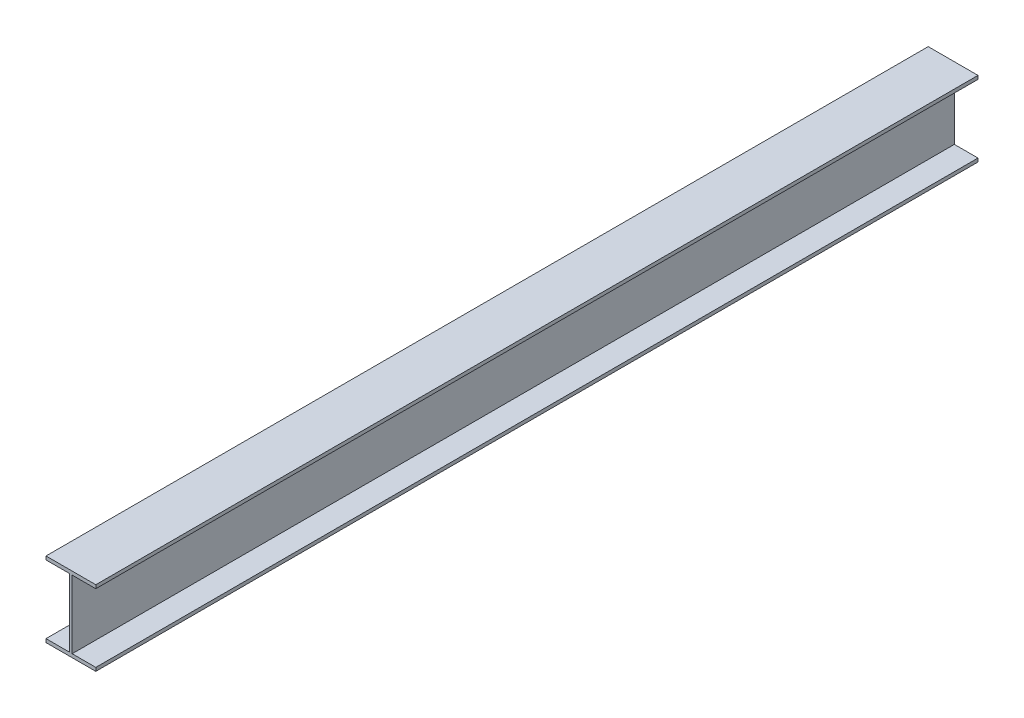
ISO-10303-21;
HEADER;
FILE_DESCRIPTION(('STEP AP214'),'2;1');
FILE_NAME('part.step','',(''),(''),'','','');
FILE_SCHEMA(('AUTOMOTIVE_DESIGN { 1 0 10303 214 1 1 1 1 }'));
ENDSEC;
DATA;
#1=APPLICATION_CONTEXT('core data for automotive mechanical design processes');
#2=APPLICATION_PROTOCOL_DEFINITION('international standard','automotive_design',2000,#1);
#3=PRODUCT_CONTEXT('',#1,'mechanical');
#4=PRODUCT('Part','Part','',(#3));
#5=PRODUCT_RELATED_PRODUCT_CATEGORY('part','',(#4));
#6=PRODUCT_DEFINITION_FORMATION('','',#4);
#7=PRODUCT_DEFINITION_CONTEXT('part definition',#1,'design');
#8=PRODUCT_DEFINITION('design','',#6,#7);
#9=PRODUCT_DEFINITION_SHAPE('','',#8);
#10=(LENGTH_UNIT() NAMED_UNIT(*) SI_UNIT(.MILLI.,.METRE.));
#11=(NAMED_UNIT(*) PLANE_ANGLE_UNIT() SI_UNIT($,.RADIAN.));
#12=(NAMED_UNIT(*) SI_UNIT($,.STERADIAN.) SOLID_ANGLE_UNIT());
#13=UNCERTAINTY_MEASURE_WITH_UNIT(LENGTH_MEASURE(1.E-05),#10,'distance_accuracy_value','');
#14=(GEOMETRIC_REPRESENTATION_CONTEXT(3) GLOBAL_UNCERTAINTY_ASSIGNED_CONTEXT((#13)) GLOBAL_UNIT_ASSIGNED_CONTEXT((#10,
#11,#12)) REPRESENTATION_CONTEXT('',''));
#15=CARTESIAN_POINT('',(0.,0.,0.));
#16=DIRECTION('',(0.,0.,1.));
#17=DIRECTION('',(1.,0.,0.));
#18=AXIS2_PLACEMENT_3D('',#15,#16,#17);
#19=CARTESIAN_POINT('',(101.6,-153.162240532958,1800.));
#20=DIRECTION('',(0.,1.,0.));
#21=DIRECTION('',(0.,0.,1.));
#22=AXIS2_PLACEMENT_3D('',#19,#20,#21);
#23=PLANE('',#22);
#24=DIRECTION('',(-1.,0.,0.));
#25=VECTOR('',#24,1.);
#26=CARTESIAN_POINT('',(101.6,-153.162240532958,1050.));
#27=LINE('',#26,#25);
#28=CARTESIAN_POINT('',(101.6,-153.162240532958,1050.));
#29=VERTEX_POINT('',#28);
#30=CARTESIAN_POINT('',(0.,-153.162240532958,1050.));
#31=VERTEX_POINT('',#30);
#32=EDGE_CURVE('E11',#29,#31,#27,.T.);
#33=ORIENTED_EDGE('',*,*,#32,.F.);
#34=DIRECTION('',(0.,0.,-1.));
#35=VECTOR('',#34,1.);
#36=CARTESIAN_POINT('',(101.6,-153.162240532958,1800.));
#37=LINE('',#36,#35);
#38=CARTESIAN_POINT('',(101.6,-153.162240532958,1800.));
#39=VERTEX_POINT('',#38);
#40=EDGE_CURVE('E181',#39,#29,#37,.T.);
#41=ORIENTED_EDGE('',*,*,#40,.F.);
#42=DIRECTION('',(1.,0.,0.));
#43=VECTOR('',#42,1.);
#44=CARTESIAN_POINT('',(101.6,-153.162240532958,1800.));
#45=LINE('',#44,#43);
#46=CARTESIAN_POINT('',(0.,-153.162240532958,1800.));
#47=VERTEX_POINT('',#46);
#48=EDGE_CURVE('E238',#47,#39,#45,.T.);
#49=ORIENTED_EDGE('',*,*,#48,.F.);
#50=DIRECTION('',(0.,0.,-1.));
#51=VECTOR('',#50,1.);
#52=CARTESIAN_POINT('',(0.,-153.162240532958,1800.));
#53=LINE('',#52,#51);
#54=EDGE_CURVE('E176',#47,#31,#53,.T.);
#55=ORIENTED_EDGE('',*,*,#54,.T.);
#56=EDGE_LOOP('',(#33,#41,#49,#55));
#57=FACE_BOUND('',#56,.T.);
#58=ADVANCED_FACE('F35',(#57),#23,.F.);
#59=DIRECTION('',(1.,0.,0.));
#60=VECTOR('',#59,1.);
#61=CARTESIAN_POINT('',(101.6,-153.162240532958,750.));
#62=LINE('',#61,#60);
#63=CARTESIAN_POINT('',(0.,-153.162240532958,750.));
#64=VERTEX_POINT('',#63);
#65=CARTESIAN_POINT('',(101.6,-153.162240532958,750.));
#66=VERTEX_POINT('',#65);
#67=EDGE_CURVE('E44',#64,#66,#62,.T.);
#68=ORIENTED_EDGE('',*,*,#67,.F.);
#69=CARTESIAN_POINT('',(0.,-153.162240532958,0.));
#70=VERTEX_POINT('',#69);
#71=EDGE_CURVE('E180',#64,#70,#53,.T.);
#72=ORIENTED_EDGE('',*,*,#71,.T.);
#73=DIRECTION('',(1.,0.,0.));
#74=VECTOR('',#73,1.);
#75=CARTESIAN_POINT('',(101.6,-153.162240532958,0.));
#76=LINE('',#75,#74);
#77=CARTESIAN_POINT('',(101.6,-153.162240532958,0.));
#78=VERTEX_POINT('',#77);
#79=EDGE_CURVE('E214',#70,#78,#76,.T.);
#80=ORIENTED_EDGE('',*,*,#79,.T.);
#81=EDGE_CURVE('E185',#66,#78,#37,.T.);
#82=ORIENTED_EDGE('',*,*,#81,.F.);
#83=EDGE_LOOP('',(#68,#72,#80,#82));
#84=FACE_BOUND('',#83,.T.);
#85=ADVANCED_FACE('F297',(#84),#23,.F.);
#86=CARTESIAN_POINT('',(0.,-7.11224053295814,1800.));
#87=DIRECTION('',(1.,0.,0.));
#88=DIRECTION('',(0.,0.,-1.));
#89=AXIS2_PLACEMENT_3D('',#86,#87,#88);
#90=PLANE('',#89);
#91=DIRECTION('',(0.,-1.,0.));
#92=VECTOR('',#91,1.);
#93=CARTESIAN_POINT('',(0.,-7.11224053295814,0.));
#94=LINE('',#93,#92);
#95=CARTESIAN_POINT('',(0.,-0.000240532958142959,0.));
#96=VERTEX_POINT('',#95);
#97=CARTESIAN_POINT('',(0.,-7.11224053295814,0.));
#98=VERTEX_POINT('',#97);
#99=EDGE_CURVE('E165',#96,#98,#94,.T.);
#100=ORIENTED_EDGE('',*,*,#99,.T.);
#101=DIRECTION('',(0.,0.,-1.));
#102=VECTOR('',#101,1.);
#103=CARTESIAN_POINT('',(0.,-7.11224053295814,1800.));
#104=LINE('',#103,#102);
#105=CARTESIAN_POINT('',(0.,-7.11224053295814,1800.));
#106=VERTEX_POINT('',#105);
#107=EDGE_CURVE('E146',#106,#98,#104,.T.);
#108=ORIENTED_EDGE('',*,*,#107,.F.);
#109=DIRECTION('',(0.,-1.,0.));
#110=VECTOR('',#109,1.);
#111=CARTESIAN_POINT('',(0.,-7.11224053295814,1800.));
#112=LINE('',#111,#110);
#113=CARTESIAN_POINT('',(0.,-0.000240532958142959,1800.));
#114=VERTEX_POINT('',#113);
#115=EDGE_CURVE('E153',#114,#106,#112,.T.);
#116=ORIENTED_EDGE('',*,*,#115,.F.);
#117=DIRECTION('',(0.,0.,-1.));
#118=VECTOR('',#117,1.);
#119=CARTESIAN_POINT('',(0.,-0.000240532958142959,1800.));
#120=LINE('',#119,#118);
#121=EDGE_CURVE('E201',#114,#96,#120,.T.);
#122=ORIENTED_EDGE('',*,*,#121,.T.);
#123=EDGE_LOOP('',(#100,#108,#116,#122));
#124=FACE_BOUND('',#123,.T.);
#125=ADVANCED_FACE('F37',(#124),#90,.F.);
#126=CARTESIAN_POINT('',(47.5660357142857,-7.11224053295814,1800.));
#127=DIRECTION('',(0.,1.,0.));
#128=DIRECTION('',(-1.,0.,0.));
#129=AXIS2_PLACEMENT_3D('',#126,#127,#128);
#130=PLANE('',#129);
#131=DIRECTION('',(1.,0.,0.));
#132=VECTOR('',#131,1.);
#133=CARTESIAN_POINT('',(47.5660357142857,-7.11224053295814,0.));
#134=LINE('',#133,#132);
#135=CARTESIAN_POINT('',(47.5660357142857,-7.11224053295814,0.));
#136=VERTEX_POINT('',#135);
#137=EDGE_CURVE('E224',#98,#136,#134,.T.);
#138=ORIENTED_EDGE('',*,*,#137,.T.);
#139=DIRECTION('',(0.,0.,-1.));
#140=VECTOR('',#139,1.);
#141=CARTESIAN_POINT('',(47.5660357142857,-7.11224053295814,1800.));
#142=LINE('',#141,#140);
#143=CARTESIAN_POINT('',(47.5660357142857,-7.11224053295814,1800.));
#144=VERTEX_POINT('',#143);
#145=EDGE_CURVE('E149',#144,#136,#142,.T.);
#146=ORIENTED_EDGE('',*,*,#145,.F.);
#147=DIRECTION('',(1.,0.,0.));
#148=VECTOR('',#147,1.);
#149=CARTESIAN_POINT('',(47.5660357142857,-7.11224053295814,1800.));
#150=LINE('',#149,#148);
#151=EDGE_CURVE('E142',#106,#144,#150,.T.);
#152=ORIENTED_EDGE('',*,*,#151,.F.);
#153=ORIENTED_EDGE('',*,*,#107,.T.);
#154=EDGE_LOOP('',(#138,#146,#152,#153));
#155=FACE_BOUND('',#154,.T.);
#156=ADVANCED_FACE('F144',(#155),#130,.F.);
#157=CARTESIAN_POINT('',(47.5660357142857,-146.050240532958,1800.));
#158=DIRECTION('',(1.,0.,0.));
#159=DIRECTION('',(0.,0.,-1.));
#160=AXIS2_PLACEMENT_3D('',#157,#158,#159);
#161=PLANE('',#160);
#162=DIRECTION('',(0.,-1.,0.));
#163=VECTOR('',#162,1.);
#164=CARTESIAN_POINT('',(47.5660357142857,-146.050240532958,0.));
#165=LINE('',#164,#163);
#166=CARTESIAN_POINT('',(47.5660357142857,-146.050240532958,0.));
#167=VERTEX_POINT('',#166);
#168=EDGE_CURVE('E222',#136,#167,#165,.T.);
#169=ORIENTED_EDGE('',*,*,#168,.T.);
#170=DIRECTION('',(0.,0.,-1.));
#171=VECTOR('',#170,1.);
#172=CARTESIAN_POINT('',(47.5660357142857,-146.050240532958,1800.));
#173=LINE('',#172,#171);
#174=CARTESIAN_POINT('',(47.5660357142857,-146.050240532958,1800.));
#175=VERTEX_POINT('',#174);
#176=EDGE_CURVE('E168',#175,#167,#173,.T.);
#177=ORIENTED_EDGE('',*,*,#176,.F.);
#178=DIRECTION('',(0.,-1.,0.));
#179=VECTOR('',#178,1.);
#180=CARTESIAN_POINT('',(47.5660357142857,-146.050240532958,1800.));
#181=LINE('',#180,#179);
#182=EDGE_CURVE('E152',#144,#175,#181,.T.);
#183=ORIENTED_EDGE('',*,*,#182,.F.);
#184=ORIENTED_EDGE('',*,*,#145,.T.);
#185=EDGE_LOOP('',(#169,#177,#183,#184));
#186=FACE_BOUND('',#185,.T.);
#187=ADVANCED_FACE('F248',(#186),#161,.F.);
#188=CARTESIAN_POINT('',(0.,-146.050240532958,1800.));
#189=DIRECTION('',(0.,-1.,0.));
#190=DIRECTION('',(1.,0.,0.));
#191=AXIS2_PLACEMENT_3D('',#188,#189,#190);
#192=PLANE('',#191);
#193=DIRECTION('',(-1.,0.,0.));
#194=VECTOR('',#193,1.);
#195=CARTESIAN_POINT('',(0.,-146.050240532958,0.));
#196=LINE('',#195,#194);
#197=CARTESIAN_POINT('',(0.,-146.050240532958,0.));
#198=VERTEX_POINT('',#197);
#199=EDGE_CURVE('E220',#167,#198,#196,.T.);
#200=ORIENTED_EDGE('',*,*,#199,.T.);
#201=DIRECTION('',(0.,0.,-1.));
#202=VECTOR('',#201,1.);
#203=CARTESIAN_POINT('',(0.,-146.050240532958,1800.));
#204=LINE('',#203,#202);
#205=CARTESIAN_POINT('',(0.,-146.050240532958,1800.));
#206=VERTEX_POINT('',#205);
#207=EDGE_CURVE('E173',#206,#198,#204,.T.);
#208=ORIENTED_EDGE('',*,*,#207,.F.);
#209=DIRECTION('',(-1.,0.,0.));
#210=VECTOR('',#209,1.);
#211=CARTESIAN_POINT('',(0.,-146.050240532958,1800.));
#212=LINE('',#211,#210);
#213=EDGE_CURVE('E242',#175,#206,#212,.T.);
#214=ORIENTED_EDGE('',*,*,#213,.F.);
#215=ORIENTED_EDGE('',*,*,#176,.T.);
#216=EDGE_LOOP('',(#200,#208,#214,#215));
#217=FACE_BOUND('',#216,.T.);
#218=ADVANCED_FACE('F252',(#217),#192,.F.);
#219=CARTESIAN_POINT('',(0.,-153.162240532958,1800.));
#220=DIRECTION('',(1.,0.,0.));
#221=DIRECTION('',(0.,0.,-1.));
#222=AXIS2_PLACEMENT_3D('',#219,#220,#221);
#223=PLANE('',#222);
#224=DIRECTION('',(0.,-1.,0.));
#225=VECTOR('',#224,1.);
#226=CARTESIAN_POINT('',(0.,-153.162240532958,0.));
#227=LINE('',#226,#225);
#228=EDGE_CURVE('E217',#198,#70,#227,.T.);
#229=ORIENTED_EDGE('',*,*,#228,.T.);
#230=ORIENTED_EDGE('',*,*,#71,.F.);
#231=CARTESIAN_POINT('',(0.,-153.162240532958,900.));
#232=VERTEX_POINT('',#231);
#233=EDGE_CURVE('E57',#232,#64,#53,.T.);
#234=ORIENTED_EDGE('',*,*,#233,.F.);
#235=EDGE_CURVE('E179',#31,#232,#53,.T.);
#236=ORIENTED_EDGE('',*,*,#235,.F.);
#237=ORIENTED_EDGE('',*,*,#54,.F.);
#238=DIRECTION('',(0.,-1.,0.));
#239=VECTOR('',#238,1.);
#240=CARTESIAN_POINT('',(0.,-153.162240532958,1800.));
#241=LINE('',#240,#239);
#242=EDGE_CURVE('E240',#206,#47,#241,.T.);
#243=ORIENTED_EDGE('',*,*,#242,.F.);
#244=ORIENTED_EDGE('',*,*,#207,.T.);
#245=EDGE_LOOP('',(#229,#230,#234,#236,#237,#243,#244));
#246=FACE_BOUND('',#245,.T.);
#247=ADVANCED_FACE('F256',(#246),#223,.F.);
#248=CARTESIAN_POINT('',(101.6,-153.162240532958,900.));
#249=VERTEX_POINT('',#248);
#250=EDGE_CURVE('E184',#29,#249,#37,.T.);
#251=ORIENTED_EDGE('',*,*,#250,.F.);
#252=ORIENTED_EDGE('',*,*,#32,.T.);
#253=ORIENTED_EDGE('',*,*,#235,.T.);
#254=ORIENTED_EDGE('',*,*,#233,.T.);
#255=ORIENTED_EDGE('',*,*,#67,.T.);
#256=EDGE_CURVE('E296',#249,#66,#37,.T.);
#257=ORIENTED_EDGE('',*,*,#256,.F.);
#258=EDGE_LOOP('',(#251,#252,#253,#254,#255,#257));
#259=FACE_BOUND('',#258,.T.);
#260=ADVANCED_FACE('F294',(#259),#23,.F.);
#261=CARTESIAN_POINT('',(101.6,-146.050240532958,1800.));
#262=DIRECTION('',(-1.,0.,0.));
#263=DIRECTION('',(0.,0.,1.));
#264=AXIS2_PLACEMENT_3D('',#261,#262,#263);
#265=PLANE('',#264);
#266=DIRECTION('',(0.,1.,0.));
#267=VECTOR('',#266,1.);
#268=CARTESIAN_POINT('',(101.6,-146.050240532958,0.));
#269=LINE('',#268,#267);
#270=CARTESIAN_POINT('',(101.6,-146.050240532958,0.));
#271=VERTEX_POINT('',#270);
#272=EDGE_CURVE('E212',#78,#271,#269,.T.);
#273=ORIENTED_EDGE('',*,*,#272,.T.);
#274=DIRECTION('',(0.,0.,-1.));
#275=VECTOR('',#274,1.);
#276=CARTESIAN_POINT('',(101.6,-146.050240532958,1800.));
#277=LINE('',#276,#275);
#278=CARTESIAN_POINT('',(101.6,-146.050240532958,1800.));
#279=VERTEX_POINT('',#278);
#280=EDGE_CURVE('E186',#279,#271,#277,.T.);
#281=ORIENTED_EDGE('',*,*,#280,.F.);
#282=DIRECTION('',(0.,1.,0.));
#283=VECTOR('',#282,1.);
#284=CARTESIAN_POINT('',(101.6,-146.050240532958,1800.));
#285=LINE('',#284,#283);
#286=EDGE_CURVE('E236',#39,#279,#285,.T.);
#287=ORIENTED_EDGE('',*,*,#286,.F.);
#288=ORIENTED_EDGE('',*,*,#40,.T.);
#289=ORIENTED_EDGE('',*,*,#250,.T.);
#290=ORIENTED_EDGE('',*,*,#256,.T.);
#291=ORIENTED_EDGE('',*,*,#81,.T.);
#292=EDGE_LOOP('',(#273,#281,#287,#288,#289,#290,#291));
#293=FACE_BOUND('',#292,.T.);
#294=ADVANCED_FACE('F265',(#293),#265,.F.);
#295=CARTESIAN_POINT('',(53.4080357142857,-146.050240532958,1800.));
#296=DIRECTION('',(0.,-1.,0.));
#297=DIRECTION('',(1.,0.,0.));
#298=AXIS2_PLACEMENT_3D('',#295,#296,#297);
#299=PLANE('',#298);
#300=DIRECTION('',(-1.,0.,0.));
#301=VECTOR('',#300,1.);
#302=CARTESIAN_POINT('',(53.4080357142857,-146.050240532958,0.));
#303=LINE('',#302,#301);
#304=CARTESIAN_POINT('',(53.4080357142857,-146.050240532958,0.));
#305=VERTEX_POINT('',#304);
#306=EDGE_CURVE('E210',#271,#305,#303,.T.);
#307=ORIENTED_EDGE('',*,*,#306,.T.);
#308=DIRECTION('',(0.,0.,-1.));
#309=VECTOR('',#308,1.);
#310=CARTESIAN_POINT('',(53.4080357142857,-146.050240532958,1800.));
#311=LINE('',#310,#309);
#312=CARTESIAN_POINT('',(53.4080357142857,-146.050240532958,1800.));
#313=VERTEX_POINT('',#312);
#314=EDGE_CURVE('E189',#313,#305,#311,.T.);
#315=ORIENTED_EDGE('',*,*,#314,.F.);
#316=DIRECTION('',(-1.,0.,0.));
#317=VECTOR('',#316,1.);
#318=CARTESIAN_POINT('',(53.4080357142857,-146.050240532958,1800.));
#319=LINE('',#318,#317);
#320=EDGE_CURVE('E234',#279,#313,#319,.T.);
#321=ORIENTED_EDGE('',*,*,#320,.F.);
#322=ORIENTED_EDGE('',*,*,#280,.T.);
#323=EDGE_LOOP('',(#307,#315,#321,#322));
#324=FACE_BOUND('',#323,.T.);
#325=ADVANCED_FACE('F271',(#324),#299,.F.);
#326=CARTESIAN_POINT('',(53.4080357142857,-7.11224053295815,1800.));
#327=DIRECTION('',(-1.,0.,0.));
#328=DIRECTION('',(0.,-1.,0.));
#329=AXIS2_PLACEMENT_3D('',#326,#327,#328);
#330=PLANE('',#329);
#331=DIRECTION('',(0.,1.,0.));
#332=VECTOR('',#331,1.);
#333=CARTESIAN_POINT('',(53.4080357142857,-7.11224053295815,0.));
#334=LINE('',#333,#332);
#335=CARTESIAN_POINT('',(53.4080357142857,-7.11224053295815,0.));
#336=VERTEX_POINT('',#335);
#337=EDGE_CURVE('E208',#305,#336,#334,.T.);
#338=ORIENTED_EDGE('',*,*,#337,.T.);
#339=DIRECTION('',(0.,0.,-1.));
#340=VECTOR('',#339,1.);
#341=CARTESIAN_POINT('',(53.4080357142857,-7.11224053295815,1800.));
#342=LINE('',#341,#340);
#343=CARTESIAN_POINT('',(53.4080357142857,-7.11224053295815,1800.));
#344=VERTEX_POINT('',#343);
#345=EDGE_CURVE('E192',#344,#336,#342,.T.);
#346=ORIENTED_EDGE('',*,*,#345,.F.);
#347=DIRECTION('',(0.,1.,0.));
#348=VECTOR('',#347,1.);
#349=CARTESIAN_POINT('',(53.4080357142857,-7.11224053295815,1800.));
#350=LINE('',#349,#348);
#351=EDGE_CURVE('E232',#313,#344,#350,.T.);
#352=ORIENTED_EDGE('',*,*,#351,.F.);
#353=ORIENTED_EDGE('',*,*,#314,.T.);
#354=EDGE_LOOP('',(#338,#346,#352,#353));
#355=FACE_BOUND('',#354,.T.);
#356=ADVANCED_FACE('F277',(#355),#330,.F.);
#357=CARTESIAN_POINT('',(101.6,-7.11224053295814,1800.));
#358=DIRECTION('',(0.,1.,0.));
#359=DIRECTION('',(-1.,0.,0.));
#360=AXIS2_PLACEMENT_3D('',#357,#358,#359);
#361=PLANE('',#360);
#362=DIRECTION('',(1.,0.,0.));
#363=VECTOR('',#362,1.);
#364=CARTESIAN_POINT('',(101.6,-7.11224053295814,0.));
#365=LINE('',#364,#363);
#366=CARTESIAN_POINT('',(101.6,-7.11224053295814,0.));
#367=VERTEX_POINT('',#366);
#368=EDGE_CURVE('E206',#336,#367,#365,.T.);
#369=ORIENTED_EDGE('',*,*,#368,.T.);
#370=DIRECTION('',(0.,0.,-1.));
#371=VECTOR('',#370,1.);
#372=CARTESIAN_POINT('',(101.6,-7.11224053295814,1800.));
#373=LINE('',#372,#371);
#374=CARTESIAN_POINT('',(101.6,-7.11224053295814,1800.));
#375=VERTEX_POINT('',#374);
#376=EDGE_CURVE('E195',#375,#367,#373,.T.);
#377=ORIENTED_EDGE('',*,*,#376,.F.);
#378=DIRECTION('',(1.,0.,0.));
#379=VECTOR('',#378,1.);
#380=CARTESIAN_POINT('',(101.6,-7.11224053295814,1800.));
#381=LINE('',#380,#379);
#382=EDGE_CURVE('E230',#344,#375,#381,.T.);
#383=ORIENTED_EDGE('',*,*,#382,.F.);
#384=ORIENTED_EDGE('',*,*,#345,.T.);
#385=EDGE_LOOP('',(#369,#377,#383,#384));
#386=FACE_BOUND('',#385,.T.);
#387=ADVANCED_FACE('F281',(#386),#361,.F.);
#388=CARTESIAN_POINT('',(101.6,-0.000240532958130516,1800.));
#389=DIRECTION('',(-1.,0.,0.));
#390=DIRECTION('',(0.,0.,1.));
#391=AXIS2_PLACEMENT_3D('',#388,#389,#390);
#392=PLANE('',#391);
#393=DIRECTION('',(0.,1.,0.));
#394=VECTOR('',#393,1.);
#395=CARTESIAN_POINT('',(101.6,-0.000240532958130516,0.));
#396=LINE('',#395,#394);
#397=CARTESIAN_POINT('',(101.6,-0.000240532958130516,0.));
#398=VERTEX_POINT('',#397);
#399=EDGE_CURVE('E204',#367,#398,#396,.T.);
#400=ORIENTED_EDGE('',*,*,#399,.T.);
#401=DIRECTION('',(0.,0.,-1.));
#402=VECTOR('',#401,1.);
#403=CARTESIAN_POINT('',(101.6,-0.000240532958130516,1800.));
#404=LINE('',#403,#402);
#405=CARTESIAN_POINT('',(101.6,-0.000240532958130516,1800.));
#406=VERTEX_POINT('',#405);
#407=EDGE_CURVE('E198',#406,#398,#404,.T.);
#408=ORIENTED_EDGE('',*,*,#407,.F.);
#409=DIRECTION('',(0.,1.,0.));
#410=VECTOR('',#409,1.);
#411=CARTESIAN_POINT('',(101.6,-0.000240532958130516,1800.));
#412=LINE('',#411,#410);
#413=EDGE_CURVE('E228',#375,#406,#412,.T.);
#414=ORIENTED_EDGE('',*,*,#413,.F.);
#415=ORIENTED_EDGE('',*,*,#376,.T.);
#416=EDGE_LOOP('',(#400,#408,#414,#415));
#417=FACE_BOUND('',#416,.T.);
#418=ADVANCED_FACE('F286',(#417),#392,.F.);
#419=CARTESIAN_POINT('',(0.,-0.000240532958142959,1800.));
#420=DIRECTION('',(0.,-1.,0.));
#421=DIRECTION('',(1.,0.,0.));
#422=AXIS2_PLACEMENT_3D('',#419,#420,#421);
#423=PLANE('',#422);
#424=DIRECTION('',(-1.,0.,0.));
#425=VECTOR('',#424,1.);
#426=CARTESIAN_POINT('',(0.,-0.000240532958142959,0.));
#427=LINE('',#426,#425);
#428=EDGE_CURVE('E162',#398,#96,#427,.T.);
#429=ORIENTED_EDGE('',*,*,#428,.T.);
#430=ORIENTED_EDGE('',*,*,#121,.F.);
#431=DIRECTION('',(-1.,0.,0.));
#432=VECTOR('',#431,1.);
#433=CARTESIAN_POINT('',(0.,-0.000240532958142959,1800.));
#434=LINE('',#433,#432);
#435=EDGE_CURVE('E158',#406,#114,#434,.T.);
#436=ORIENTED_EDGE('',*,*,#435,.F.);
#437=ORIENTED_EDGE('',*,*,#407,.T.);
#438=EDGE_LOOP('',(#429,#430,#436,#437));
#439=FACE_BOUND('',#438,.T.);
#440=ADVANCED_FACE('F289',(#439),#423,.F.);
#441=CARTESIAN_POINT('',(0.,0.,1800.));
#442=DIRECTION('',(0.,0.,-1.));
#443=DIRECTION('',(-1.,0.,0.));
#444=AXIS2_PLACEMENT_3D('',#441,#442,#443);
#445=PLANE('',#444);
#446=ORIENTED_EDGE('',*,*,#115,.T.);
#447=ORIENTED_EDGE('',*,*,#151,.T.);
#448=ORIENTED_EDGE('',*,*,#182,.T.);
#449=ORIENTED_EDGE('',*,*,#213,.T.);
#450=ORIENTED_EDGE('',*,*,#242,.T.);
#451=ORIENTED_EDGE('',*,*,#48,.T.);
#452=ORIENTED_EDGE('',*,*,#286,.T.);
#453=ORIENTED_EDGE('',*,*,#320,.T.);
#454=ORIENTED_EDGE('',*,*,#351,.T.);
#455=ORIENTED_EDGE('',*,*,#382,.T.);
#456=ORIENTED_EDGE('',*,*,#413,.T.);
#457=ORIENTED_EDGE('',*,*,#435,.T.);
#458=EDGE_LOOP('',(#446,#447,#448,#449,#450,#451,#452,#453,#454,#455,#456,#457));
#459=FACE_BOUND('',#458,.T.);
#460=ADVANCED_FACE('F156',(#459),#445,.F.);
#461=CARTESIAN_POINT('',(0.,0.,0.));
#462=DIRECTION('',(0.,0.,-1.));
#463=DIRECTION('',(-1.,0.,0.));
#464=AXIS2_PLACEMENT_3D('',#461,#462,#463);
#465=PLANE('',#464);
#466=ORIENTED_EDGE('',*,*,#99,.F.);
#467=ORIENTED_EDGE('',*,*,#428,.F.);
#468=ORIENTED_EDGE('',*,*,#399,.F.);
#469=ORIENTED_EDGE('',*,*,#368,.F.);
#470=ORIENTED_EDGE('',*,*,#337,.F.);
#471=ORIENTED_EDGE('',*,*,#306,.F.);
#472=ORIENTED_EDGE('',*,*,#272,.F.);
#473=ORIENTED_EDGE('',*,*,#79,.F.);
#474=ORIENTED_EDGE('',*,*,#228,.F.);
#475=ORIENTED_EDGE('',*,*,#199,.F.);
#476=ORIENTED_EDGE('',*,*,#168,.F.);
#477=ORIENTED_EDGE('',*,*,#137,.F.);
#478=EDGE_LOOP('',(#466,#467,#468,#469,#470,#471,#472,#473,#474,#475,#476,#477));
#479=FACE_BOUND('',#478,.T.);
#480=ADVANCED_FACE('F291',(#479),#465,.T.);
#481=CLOSED_SHELL('',(#58,#85,#125,#156,#187,#218,#247,#260,#294,#325,#356,#387,#418,#440,#460,#480));
#482=MANIFOLD_SOLID_BREP('B2',#481);
#483=ADVANCED_BREP_SHAPE_REPRESENTATION('',(#18,#482),#14);
#484=SHAPE_DEFINITION_REPRESENTATION(#9,#483);
ENDSEC;
END-ISO-10303-21;
